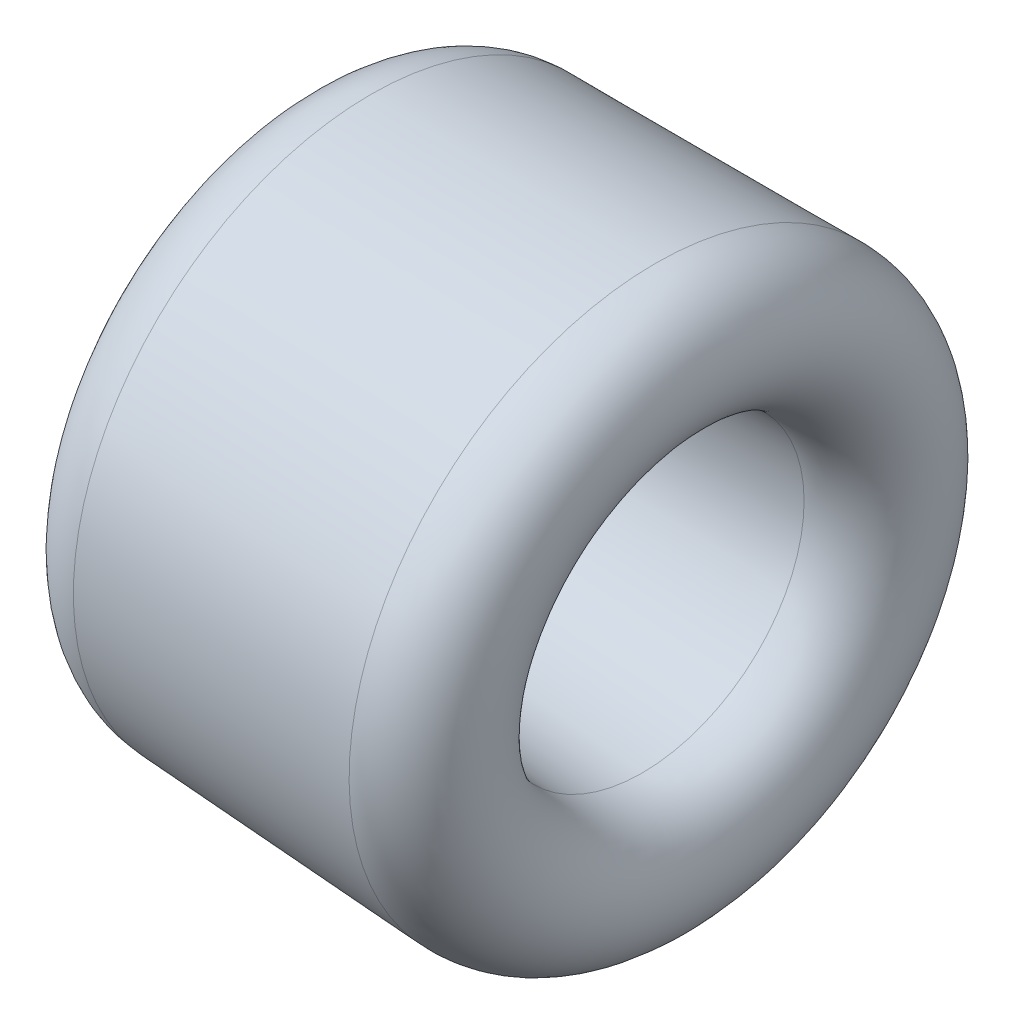
ISO-10303-21;
HEADER;
FILE_DESCRIPTION(('STEP AP214'),'2;1');
FILE_NAME('part.step','',(''),(''),'','','');
FILE_SCHEMA(('AUTOMOTIVE_DESIGN { 1 0 10303 214 1 1 1 1 }'));
ENDSEC;
DATA;
#1=APPLICATION_CONTEXT('core data for automotive mechanical design processes');
#2=APPLICATION_PROTOCOL_DEFINITION('international standard','automotive_design',2000,#1);
#3=PRODUCT_CONTEXT('',#1,'mechanical');
#4=PRODUCT('Part','Part','',(#3));
#5=PRODUCT_RELATED_PRODUCT_CATEGORY('part','',(#4));
#6=PRODUCT_DEFINITION_FORMATION('','',#4);
#7=PRODUCT_DEFINITION_CONTEXT('part definition',#1,'design');
#8=PRODUCT_DEFINITION('design','',#6,#7);
#9=PRODUCT_DEFINITION_SHAPE('','',#8);
#10=(LENGTH_UNIT() NAMED_UNIT(*) SI_UNIT(.MILLI.,.METRE.));
#11=(NAMED_UNIT(*) PLANE_ANGLE_UNIT() SI_UNIT($,.RADIAN.));
#12=(NAMED_UNIT(*) SI_UNIT($,.STERADIAN.) SOLID_ANGLE_UNIT());
#13=UNCERTAINTY_MEASURE_WITH_UNIT(LENGTH_MEASURE(1.E-05),#10,'distance_accuracy_value','');
#14=(GEOMETRIC_REPRESENTATION_CONTEXT(3) GLOBAL_UNCERTAINTY_ASSIGNED_CONTEXT((#13)) GLOBAL_UNIT_ASSIGNED_CONTEXT((#10,
#11,#12)) REPRESENTATION_CONTEXT('',''));
#15=CARTESIAN_POINT('',(0.,0.,0.));
#16=DIRECTION('',(0.,0.,1.));
#17=DIRECTION('',(1.,0.,0.));
#18=AXIS2_PLACEMENT_3D('',#15,#16,#17);
#19=CARTESIAN_POINT('',(-177.455075043587,-149.525602651744,0.));
#20=DIRECTION('',(0.999039600578672,-0.0438163950549136,0.));
#21=DIRECTION('',(0.0438163950549136,0.999039600578672,0.));
#22=AXIS2_PLACEMENT_3D('',#19,#20,#21);
#23=CONICAL_SURFACE('',#22,246.864843053174,0.0297904034914446);
#24=CARTESIAN_POINT('',(68.9023679896222,-160.330474693262,0.));
#25=DIRECTION('',(0.999039600578672,-0.0438163950549136,0.));
#26=DIRECTION('',(0.0438163950549136,0.999039600578672,0.));
#27=AXIS2_PLACEMENT_3D('',#24,#25,#26);
#28=CIRCLE('',#27,254.213159843242);
#29=CARTESIAN_POINT('',(80.0410722294716,93.638538978373,0.));
#30=VERTEX_POINT('',#29);
#31=EDGE_CURVE('E46',#30,#30,#28,.T.);
#32=ORIENTED_EDGE('',*,*,#31,.F.);
#33=EDGE_LOOP('',(#32));
#34=FACE_BOUND('',#33,.T.);
#35=CARTESIAN_POINT('',(-177.455075043587,-149.525602651744,0.));
#36=DIRECTION('',(0.999039600578672,-0.0438163950549136,0.));
#37=DIRECTION('',(0.0438163950549136,0.999039600578672,0.));
#38=AXIS2_PLACEMENT_3D('',#35,#36,#37);
#39=CIRCLE('',#38,246.864843053174);
#40=CARTESIAN_POINT('',(-166.638347555199,97.1021515490153,0.));
#41=VERTEX_POINT('',#40);
#42=EDGE_CURVE('E10',#41,#41,#39,.T.);
#43=ORIENTED_EDGE('',*,*,#42,.T.);
#44=EDGE_LOOP('',(#43));
#45=FACE_BOUND('',#44,.T.);
#46=ADVANCED_FACE('F32',(#34,#45),#23,.T.);
#47=CARTESIAN_POINT('',(-174.749474381875,-149.644266283682,0.));
#48=DIRECTION('',(0.999039600578672,-0.0438163950549136,0.));
#49=DIRECTION('',(0.0438163950549136,0.999039600578672,0.));
#50=AXIS2_PLACEMENT_3D('',#47,#48,#49);
#51=TOROIDAL_SURFACE('',#50,183.445465394803,63.4771755718012);
#52=CARTESIAN_POINT('',(-171.897789260956,-149.769336963321,0.));
#53=DIRECTION('',(0.999039600578672,-0.0438163950549136,0.));
#54=DIRECTION('',(0.0438163950549136,0.999039600578672,0.));
#55=AXIS2_PLACEMENT_3D('',#52,#53,#54);
#56=CIRCLE('',#55,120.03250088541);
#57=CARTESIAN_POINT('',(-166.638397782731,-29.8521152223014,0.));
#58=VERTEX_POINT('',#57);
#59=EDGE_CURVE('E38',#58,#58,#56,.T.);
#60=ORIENTED_EDGE('',*,*,#59,.T.);
#61=EDGE_LOOP('',(#60));
#62=FACE_BOUND('',#61,.T.);
#63=ORIENTED_EDGE('',*,*,#42,.F.);
#64=EDGE_LOOP('',(#63));
#65=FACE_BOUND('',#64,.T.);
#66=ADVANCED_FACE('F97',(#62,#65),#51,.T.);
#67=CARTESIAN_POINT('',(-171.897789260956,-149.769336963321,0.));
#68=DIRECTION('',(0.999039600578672,-0.0438163950549136,0.));
#69=DIRECTION('',(0.0438163950549136,0.999039600578672,0.));
#70=AXIS2_PLACEMENT_3D('',#67,#68,#69);
#71=CONICAL_SURFACE('',#70,120.03250088541,0.0578608190447236);
#72=CARTESIAN_POINT('',(74.3718191847319,-160.57035671011,0.));
#73=DIRECTION('',(0.999039600578672,-0.0438163950549136,0.));
#74=DIRECTION('',(0.0438163950549136,0.999039600578672,0.));
#75=AXIS2_PLACEMENT_3D('',#72,#73,#74);
#76=CIRCLE('',#75,134.311498691261);
#77=CARTESIAN_POINT('',(80.2568648718057,-26.38785070447,0.));
#78=VERTEX_POINT('',#77);
#79=EDGE_CURVE('E42',#78,#78,#76,.T.);
#80=ORIENTED_EDGE('',*,*,#79,.T.);
#81=EDGE_LOOP('',(#80));
#82=FACE_BOUND('',#81,.T.);
#83=ORIENTED_EDGE('',*,*,#59,.F.);
#84=EDGE_LOOP('',(#83));
#85=FACE_BOUND('',#84,.T.);
#86=ADVANCED_FACE('F94',(#82,#85),#71,.F.);
#87=CARTESIAN_POINT('',(71.456161698944,-160.442480297435,0.));
#88=DIRECTION('',(0.999039600578672,-0.0438163950549136,0.));
#89=DIRECTION('',(0.0438163950549136,0.999039600578672,0.));
#90=AXIS2_PLACEMENT_3D('',#87,#88,#89);
#91=TOROIDAL_SURFACE('',#90,194.254059976538,60.0135656696927);
#92=ORIENTED_EDGE('',*,*,#31,.T.);
#93=EDGE_LOOP('',(#92));
#94=FACE_BOUND('',#93,.T.);
#95=ORIENTED_EDGE('',*,*,#79,.F.);
#96=EDGE_LOOP('',(#95));
#97=FACE_BOUND('',#96,.T.);
#98=ADVANCED_FACE('F92',(#94,#97),#91,.T.);
#99=CLOSED_SHELL('',(#46,#66,#86,#98));
#100=CARTESIAN_POINT('',(-177.090401047266,-149.54159671232,0.));
#101=DIRECTION('',(0.999039600578672,-0.0438163950549136,0.));
#102=DIRECTION('',(0.0438163950549136,0.999039600578672,0.));
#103=AXIS2_PLACEMENT_3D('',#100,#101,#102);
#104=CONICAL_SURFACE('',#103,236.871281518131,0.0297904034914444);
#105=CARTESIAN_POINT('',(69.2668521803389,-160.346460429245,0.));
#106=DIRECTION('',(0.999039600578672,-0.0438163950549136,0.));
#107=DIRECTION('',(0.0438163950549136,0.999039600578672,0.));
#108=AXIS2_PLACEMENT_3D('',#105,#106,#107);
#109=CIRCLE('',#108,244.219592646703);
#110=CARTESIAN_POINT('',(79.9676743318969,83.638583862003,0.));
#111=VERTEX_POINT('',#110);
#112=EDGE_CURVE('E60',#111,#111,#109,.T.);
#113=ORIENTED_EDGE('',*,*,#112,.T.);
#114=EDGE_LOOP('',(#113));
#115=FACE_BOUND('',#114,.T.);
#116=CARTESIAN_POINT('',(-177.090401047266,-149.54159671232,0.));
#117=DIRECTION('',(0.999039600578672,-0.0438163950549136,0.));
#118=DIRECTION('',(0.0438163950549136,0.999039600578672,0.));
#119=AXIS2_PLACEMENT_3D('',#116,#117,#118);
#120=CIRCLE('',#119,236.871281518131);
#121=CARTESIAN_POINT('',(-166.711555399104,87.1021937641118,0.));
#122=VERTEX_POINT('',#121);
#123=EDGE_CURVE('E51',#122,#122,#120,.T.);
#124=ORIENTED_EDGE('',*,*,#123,.F.);
#125=EDGE_LOOP('',(#124));
#126=FACE_BOUND('',#125,.T.);
#127=ADVANCED_FACE('F64',(#115,#126),#104,.F.);
#128=CARTESIAN_POINT('',(-174.749474381875,-149.644266283682,0.));
#129=DIRECTION('',(0.999039600578672,-0.0438163950549136,0.));
#130=DIRECTION('',(0.0438163950549136,0.999039600578672,0.));
#131=AXIS2_PLACEMENT_3D('',#128,#129,#130);
#132=TOROIDAL_SURFACE('',#131,183.445465394803,53.4771755718012);
#133=CARTESIAN_POINT('',(-172.408547716484,-149.746935855044,0.));
#134=DIRECTION('',(0.999039600578672,-0.0438163950549136,0.));
#135=DIRECTION('',(0.0438163950549136,0.999039600578672,0.));
#136=AXIS2_PLACEMENT_3D('',#133,#134,#135);
#137=CIRCLE('',#136,130.019649271475);
#138=CARTESIAN_POINT('',(-166.711555399104,-19.8521573794907,0.));
#139=VERTEX_POINT('',#138);
#140=EDGE_CURVE('E54',#139,#139,#137,.T.);
#141=ORIENTED_EDGE('',*,*,#140,.F.);
#142=EDGE_LOOP('',(#141));
#143=FACE_BOUND('',#142,.T.);
#144=ORIENTED_EDGE('',*,*,#123,.T.);
#145=EDGE_LOOP('',(#144));
#146=FACE_BOUND('',#145,.T.);
#147=ADVANCED_FACE('F77',(#143,#146),#132,.F.);
#148=CARTESIAN_POINT('',(-172.408547716484,-149.746935855044,0.));
#149=DIRECTION('',(0.999039600578672,-0.0438163950549136,0.));
#150=DIRECTION('',(0.0438163950549136,0.999039600578672,0.));
#151=AXIS2_PLACEMENT_3D('',#148,#149,#150);
#152=CONICAL_SURFACE('',#151,130.019649271475,0.0578608190447236);
#153=CARTESIAN_POINT('',(73.8421182810214,-160.547124814153,0.));
#154=DIRECTION('',(0.999039600578672,-0.0438163950549136,0.));
#155=DIRECTION('',(0.0438163950549136,0.999039600578672,0.));
#156=AXIS2_PLACEMENT_3D('',#153,#154,#155);
#157=CIRCLE('',#156,144.297548772189);
#158=CARTESIAN_POINT('',(80.1647166834793,-16.3881593243037,0.));
#159=VERTEX_POINT('',#158);
#160=EDGE_CURVE('E57',#159,#159,#157,.T.);
#161=ORIENTED_EDGE('',*,*,#160,.F.);
#162=EDGE_LOOP('',(#161));
#163=FACE_BOUND('',#162,.T.);
#164=ORIENTED_EDGE('',*,*,#140,.T.);
#165=EDGE_LOOP('',(#164));
#166=FACE_BOUND('',#165,.T.);
#167=ADVANCED_FACE('F70',(#163,#166),#152,.T.);
#168=CARTESIAN_POINT('',(71.456161698944,-160.442480297435,0.));
#169=DIRECTION('',(0.999039600578672,-0.0438163950549136,0.));
#170=DIRECTION('',(0.0438163950549136,0.999039600578672,0.));
#171=AXIS2_PLACEMENT_3D('',#168,#169,#170);
#172=TOROIDAL_SURFACE('',#171,194.254059976538,50.0135656696927);
#173=ORIENTED_EDGE('',*,*,#112,.F.);
#174=EDGE_LOOP('',(#173));
#175=FACE_BOUND('',#174,.T.);
#176=ORIENTED_EDGE('',*,*,#160,.T.);
#177=EDGE_LOOP('',(#176));
#178=FACE_BOUND('',#177,.T.);
#179=ADVANCED_FACE('F67',(#175,#178),#172,.F.);
#180=CLOSED_SHELL('',(#127,#147,#167,#179));
#181=ORIENTED_CLOSED_SHELL('',*,#180,.T.);
#182=BREP_WITH_VOIDS('B2',#99,(#181));
#183=ADVANCED_BREP_SHAPE_REPRESENTATION('',(#18,#182),#14);
#184=SHAPE_DEFINITION_REPRESENTATION(#9,#183);
ENDSEC;
END-ISO-10303-21;
